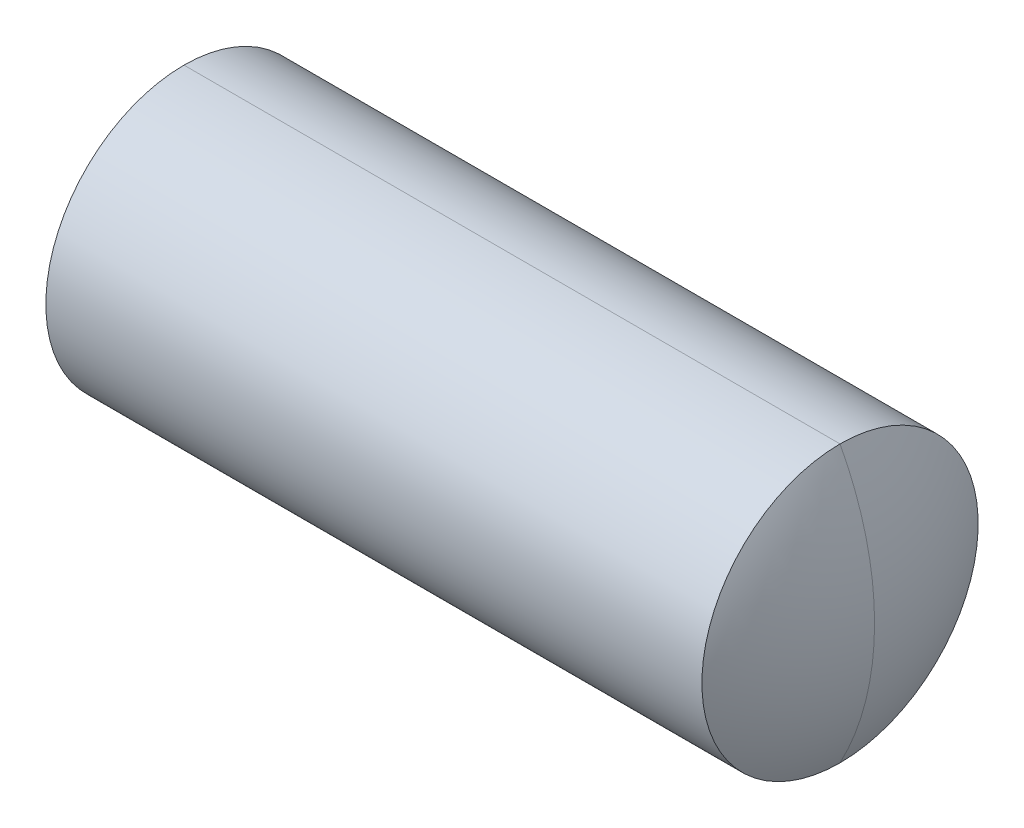
ISO-10303-21;
HEADER;
FILE_DESCRIPTION(('STEP AP214'),'2;1');
FILE_NAME('part.step','',(''),(''),'','','');
FILE_SCHEMA(('AUTOMOTIVE_DESIGN { 1 0 10303 214 1 1 1 1 }'));
ENDSEC;
DATA;
#1=APPLICATION_CONTEXT('core data for automotive mechanical design processes');
#2=APPLICATION_PROTOCOL_DEFINITION('international standard','automotive_design',2000,#1);
#3=PRODUCT_CONTEXT('',#1,'mechanical');
#4=PRODUCT('Part','Part','',(#3));
#5=PRODUCT_RELATED_PRODUCT_CATEGORY('part','',(#4));
#6=PRODUCT_DEFINITION_FORMATION('','',#4);
#7=PRODUCT_DEFINITION_CONTEXT('part definition',#1,'design');
#8=PRODUCT_DEFINITION('design','',#6,#7);
#9=PRODUCT_DEFINITION_SHAPE('','',#8);
#10=(LENGTH_UNIT() NAMED_UNIT(*) SI_UNIT(.MILLI.,.METRE.));
#11=(NAMED_UNIT(*) PLANE_ANGLE_UNIT() SI_UNIT($,.RADIAN.));
#12=(NAMED_UNIT(*) SI_UNIT($,.STERADIAN.) SOLID_ANGLE_UNIT());
#13=UNCERTAINTY_MEASURE_WITH_UNIT(LENGTH_MEASURE(1.E-05),#10,'distance_accuracy_value','');
#14=(GEOMETRIC_REPRESENTATION_CONTEXT(3) GLOBAL_UNCERTAINTY_ASSIGNED_CONTEXT((#13)) GLOBAL_UNIT_ASSIGNED_CONTEXT((#10,
#11,#12)) REPRESENTATION_CONTEXT('',''));
#15=CARTESIAN_POINT('',(0.,0.,0.));
#16=DIRECTION('',(0.,0.,1.));
#17=DIRECTION('',(1.,0.,0.));
#18=AXIS2_PLACEMENT_3D('',#15,#16,#17);
#19=CARTESIAN_POINT('',(3.,-0.5773502691896,-1.));
#20=DIRECTION('',(0.,-0.866025403784429,-0.500000000000017));
#21=DIRECTION('',(0.,0.500000000000017,-0.866025403784429));
#22=AXIS2_PLACEMENT_3D('',#19,#20,#21);
#23=PLANE('',#22);
#24=DIRECTION('',(0.,0.500000000000017,-0.866025403784429));
#25=VECTOR('',#24,1.);
#26=CARTESIAN_POINT('',(3.,-0.5773502691896,-1.));
#27=LINE('',#26,#25);
#28=CARTESIAN_POINT('',(3.,-0.5773502691896,-1.));
#29=VERTEX_POINT('',#28);
#30=CARTESIAN_POINT('',(3.,-1.15470053837909,0.));
#31=VERTEX_POINT('',#30);
#32=EDGE_CURVE('E163',#29,#31,#27,.F.);
#33=ORIENTED_EDGE('',*,*,#32,.F.);
#34=DIRECTION('',(-1.,0.,0.));
#35=VECTOR('',#34,1.);
#36=CARTESIAN_POINT('',(3.,-0.5773502691896,-1.));
#37=LINE('',#36,#35);
#38=CARTESIAN_POINT('',(0.,-0.5773502691896,-1.));
#39=VERTEX_POINT('',#38);
#40=EDGE_CURVE('E92',#29,#39,#37,.T.);
#41=ORIENTED_EDGE('',*,*,#40,.T.);
#42=DIRECTION('',(0.,0.500000000000017,-0.866025403784429));
#43=VECTOR('',#42,1.);
#44=CARTESIAN_POINT('',(0.,-0.5773502691896,-1.));
#45=LINE('',#44,#43);
#46=CARTESIAN_POINT('',(0.,-1.15470053837905,0.));
#47=VERTEX_POINT('',#46);
#48=EDGE_CURVE('E165',#47,#39,#45,.T.);
#49=ORIENTED_EDGE('',*,*,#48,.F.);
#50=DIRECTION('',(1.,0.,0.));
#51=VECTOR('',#50,1.);
#52=CARTESIAN_POINT('',(3.,-1.154700538379,0.));
#53=LINE('',#52,#51);
#54=EDGE_CURVE('E158',#47,#31,#53,.T.);
#55=ORIENTED_EDGE('',*,*,#54,.T.);
#56=EDGE_LOOP('',(#33,#41,#49,#55));
#57=FACE_BOUND('',#56,.T.);
#58=ADVANCED_FACE('F17',(#57),#23,.F.);
#59=CARTESIAN_POINT('',(3.,-1.154700538379,0.));
#60=DIRECTION('',(0.,-0.866025403784429,0.500000000000017));
#61=DIRECTION('',(0.,-0.500000000000017,-0.866025403784429));
#62=AXIS2_PLACEMENT_3D('',#59,#60,#61);
#63=PLANE('',#62);
#64=DIRECTION('',(0.,-0.500000000000017,-0.866025403784429));
#65=VECTOR('',#64,1.);
#66=CARTESIAN_POINT('',(3.,-1.154700538379,0.));
#67=LINE('',#66,#65);
#68=CARTESIAN_POINT('',(3.,-0.577350269189506,0.999999999999946));
#69=VERTEX_POINT('',#68);
#70=EDGE_CURVE('E156',#31,#69,#67,.F.);
#71=ORIENTED_EDGE('',*,*,#70,.F.);
#72=ORIENTED_EDGE('',*,*,#54,.F.);
#73=DIRECTION('',(0.,-0.500000000000017,-0.866025403784429));
#74=VECTOR('',#73,1.);
#75=CARTESIAN_POINT('',(0.,-1.154700538379,0.));
#76=LINE('',#75,#74);
#77=CARTESIAN_POINT('',(0.,-0.577350269189553,0.999999999999973));
#78=VERTEX_POINT('',#77);
#79=EDGE_CURVE('E161',#78,#47,#76,.T.);
#80=ORIENTED_EDGE('',*,*,#79,.F.);
#81=DIRECTION('',(1.,0.,0.));
#82=VECTOR('',#81,1.);
#83=CARTESIAN_POINT('',(3.,-0.5773502691896,1.));
#84=LINE('',#83,#82);
#85=EDGE_CURVE('E88',#78,#69,#84,.T.);
#86=ORIENTED_EDGE('',*,*,#85,.T.);
#87=EDGE_LOOP('',(#71,#72,#80,#86));
#88=FACE_BOUND('',#87,.T.);
#89=ADVANCED_FACE('F234',(#88),#63,.F.);
#90=CARTESIAN_POINT('',(3.,0.5773502691896,-1.));
#91=DIRECTION('',(0.,0.,-1.));
#92=DIRECTION('',(-1.,0.,0.));
#93=AXIS2_PLACEMENT_3D('',#90,#91,#92);
#94=PLANE('',#93);
#95=DIRECTION('',(0.,1.,0.));
#96=VECTOR('',#95,1.);
#97=CARTESIAN_POINT('',(3.,1.154700538379,-1.));
#98=LINE('',#97,#96);
#99=CARTESIAN_POINT('',(3.,0.577350269189553,-0.999999999999973));
#100=VERTEX_POINT('',#99);
#101=EDGE_CURVE('E148',#100,#29,#98,.F.);
#102=ORIENTED_EDGE('',*,*,#101,.F.);
#103=DIRECTION('',(1.,0.,0.));
#104=VECTOR('',#103,1.);
#105=CARTESIAN_POINT('',(3.,0.577350269189411,-0.999999999999891));
#106=LINE('',#105,#104);
#107=CARTESIAN_POINT('',(0.,0.577350269189553,-0.999999999999973));
#108=VERTEX_POINT('',#107);
#109=EDGE_CURVE('E101',#100,#108,#106,.F.);
#110=ORIENTED_EDGE('',*,*,#109,.T.);
#111=DIRECTION('',(0.,1.,0.));
#112=VECTOR('',#111,1.);
#113=CARTESIAN_POINT('',(0.,0.5773502691896,-1.));
#114=LINE('',#113,#112);
#115=EDGE_CURVE('E154',#39,#108,#114,.T.);
#116=ORIENTED_EDGE('',*,*,#115,.F.);
#117=ORIENTED_EDGE('',*,*,#40,.F.);
#118=EDGE_LOOP('',(#102,#110,#116,#117));
#119=FACE_BOUND('',#118,.T.);
#120=ADVANCED_FACE('F226',(#119),#94,.F.);
#121=CARTESIAN_POINT('',(3.,-0.5773502691896,1.));
#122=DIRECTION('',(0.,0.,1.));
#123=DIRECTION('',(1.,0.,0.));
#124=AXIS2_PLACEMENT_3D('',#121,#122,#123);
#125=PLANE('',#124);
#126=DIRECTION('',(0.,1.,0.));
#127=VECTOR('',#126,1.);
#128=CARTESIAN_POINT('',(3.,1.154700538379,1.));
#129=LINE('',#128,#127);
#130=CARTESIAN_POINT('',(3.,0.5773502691896,1.));
#131=VERTEX_POINT('',#130);
#132=EDGE_CURVE('E146',#69,#131,#129,.T.);
#133=ORIENTED_EDGE('',*,*,#132,.F.);
#134=ORIENTED_EDGE('',*,*,#85,.F.);
#135=DIRECTION('',(0.,1.,0.));
#136=VECTOR('',#135,1.);
#137=CARTESIAN_POINT('',(0.,-0.5773502691896,1.));
#138=LINE('',#137,#136);
#139=CARTESIAN_POINT('',(0.,0.5773502691896,1.));
#140=VERTEX_POINT('',#139);
#141=EDGE_CURVE('E81',#140,#78,#138,.F.);
#142=ORIENTED_EDGE('',*,*,#141,.F.);
#143=DIRECTION('',(1.,0.,0.));
#144=VECTOR('',#143,1.);
#145=CARTESIAN_POINT('',(3.,0.5773502691896,1.));
#146=LINE('',#145,#144);
#147=EDGE_CURVE('E85',#140,#131,#146,.T.);
#148=ORIENTED_EDGE('',*,*,#147,.T.);
#149=EDGE_LOOP('',(#133,#134,#142,#148));
#150=FACE_BOUND('',#149,.T.);
#151=ADVANCED_FACE('F84',(#150),#125,.F.);
#152=CARTESIAN_POINT('',(3.,1.154700538379,0.));
#153=DIRECTION('',(-1.,0.,0.));
#154=DIRECTION('',(0.,0.,1.));
#155=AXIS2_PLACEMENT_3D('',#152,#153,#154);
#156=PLANE('',#155);
#157=ORIENTED_EDGE('',*,*,#132,.T.);
#158=DIRECTION('',(0.,-0.500000000000017,0.866025403784429));
#159=VECTOR('',#158,1.);
#160=CARTESIAN_POINT('',(3.,0.5773502691896,1.));
#161=LINE('',#160,#159);
#162=CARTESIAN_POINT('',(3.,1.15470053837905,0.));
#163=VERTEX_POINT('',#162);
#164=EDGE_CURVE('E100',#131,#163,#161,.F.);
#165=ORIENTED_EDGE('',*,*,#164,.T.);
#166=DIRECTION('',(0.,0.500000000000017,0.866025403784429));
#167=VECTOR('',#166,1.);
#168=CARTESIAN_POINT('',(3.,1.154700538379,0.));
#169=LINE('',#168,#167);
#170=EDGE_CURVE('E142',#163,#100,#169,.F.);
#171=ORIENTED_EDGE('',*,*,#170,.T.);
#172=ORIENTED_EDGE('',*,*,#101,.T.);
#173=ORIENTED_EDGE('',*,*,#32,.T.);
#174=ORIENTED_EDGE('',*,*,#70,.T.);
#175=EDGE_LOOP('',(#157,#165,#171,#172,#173,#174));
#176=FACE_BOUND('',#175,.T.);
#177=ADVANCED_FACE('F211',(#176),#156,.T.);
#178=CARTESIAN_POINT('',(3.,1.154700538379,0.));
#179=DIRECTION('',(0.,0.866025403784429,-0.500000000000017));
#180=DIRECTION('',(0.,0.500000000000017,0.866025403784429));
#181=AXIS2_PLACEMENT_3D('',#178,#179,#180);
#182=PLANE('',#181);
#183=ORIENTED_EDGE('',*,*,#170,.F.);
#184=DIRECTION('',(1.,0.,0.));
#185=VECTOR('',#184,1.);
#186=CARTESIAN_POINT('',(3.,1.15470053837919,1.08637057683047E-13));
#187=LINE('',#186,#185);
#188=CARTESIAN_POINT('',(0.,1.15470053837905,0.));
#189=VERTEX_POINT('',#188);
#190=EDGE_CURVE('E176',#163,#189,#187,.F.);
#191=ORIENTED_EDGE('',*,*,#190,.T.);
#192=DIRECTION('',(0.,0.500000000000017,0.866025403784429));
#193=VECTOR('',#192,1.);
#194=CARTESIAN_POINT('',(0.,1.154700538379,0.));
#195=LINE('',#194,#193);
#196=EDGE_CURVE('E106',#108,#189,#195,.T.);
#197=ORIENTED_EDGE('',*,*,#196,.F.);
#198=ORIENTED_EDGE('',*,*,#109,.F.);
#199=EDGE_LOOP('',(#183,#191,#197,#198));
#200=FACE_BOUND('',#199,.T.);
#201=ADVANCED_FACE('F134',(#200),#182,.F.);
#202=CARTESIAN_POINT('',(5.75,0.,0.));
#203=DIRECTION('',(0.,-1.,0.));
#204=DIRECTION('',(0.,0.,1.));
#205=AXIS2_PLACEMENT_3D('',#202,#203,#204);
#206=SPHERICAL_SURFACE('',#205,4.25);
#207=CARTESIAN_POINT('',(5.75,0.,0.));
#208=DIRECTION('',(0.,0.,1.));
#209=DIRECTION('',(0.,-1.,0.));
#210=AXIS2_PLACEMENT_3D('',#207,#208,#209);
#211=CIRCLE('',#210,4.25);
#212=CARTESIAN_POINT('',(9.5,-2.,0.));
#213=VERTEX_POINT('',#212);
#214=CARTESIAN_POINT('',(10.,0.,0.));
#215=VERTEX_POINT('',#214);
#216=EDGE_CURVE('E174',#213,#215,#211,.T.);
#217=ORIENTED_EDGE('',*,*,#216,.F.);
#218=CARTESIAN_POINT('',(9.5,0.,0.));
#219=DIRECTION('',(-1.,0.,0.));
#220=DIRECTION('',(0.,0.,1.));
#221=AXIS2_PLACEMENT_3D('',#218,#219,#220);
#222=CIRCLE('',#221,2.);
#223=CARTESIAN_POINT('',(9.5,2.,0.));
#224=VERTEX_POINT('',#223);
#225=EDGE_CURVE('E20',#224,#213,#222,.T.);
#226=ORIENTED_EDGE('',*,*,#225,.F.);
#227=CARTESIAN_POINT('',(5.75,0.,0.));
#228=DIRECTION('',(0.,0.,1.));
#229=DIRECTION('',(0.,-1.,0.));
#230=AXIS2_PLACEMENT_3D('',#227,#228,#229);
#231=CIRCLE('',#230,4.25);
#232=EDGE_CURVE('E118',#215,#224,#231,.T.);
#233=ORIENTED_EDGE('',*,*,#232,.F.);
#234=EDGE_LOOP('',(#217,#226,#233));
#235=FACE_BOUND('',#234,.T.);
#236=ADVANCED_FACE('F130',(#235),#206,.T.);
#237=CARTESIAN_POINT('',(3.,0.5773502691896,1.));
#238=DIRECTION('',(0.,0.866025403784429,0.500000000000017));
#239=DIRECTION('',(0.,-0.500000000000017,0.866025403784429));
#240=AXIS2_PLACEMENT_3D('',#237,#238,#239);
#241=PLANE('',#240);
#242=ORIENTED_EDGE('',*,*,#164,.F.);
#243=ORIENTED_EDGE('',*,*,#147,.F.);
#244=DIRECTION('',(0.,0.499999999999853,-0.866025403784523));
#245=VECTOR('',#244,1.);
#246=CARTESIAN_POINT('',(0.,0.5773502691896,1.));
#247=LINE('',#246,#245);
#248=EDGE_CURVE('E99',#140,#189,#247,.T.);
#249=ORIENTED_EDGE('',*,*,#248,.T.);
#250=ORIENTED_EDGE('',*,*,#190,.F.);
#251=EDGE_LOOP('',(#242,#243,#249,#250));
#252=FACE_BOUND('',#251,.T.);
#253=ADVANCED_FACE('F97',(#252),#241,.F.);
#254=CARTESIAN_POINT('',(5.75,0.,0.));
#255=DIRECTION('',(0.,-1.,0.));
#256=DIRECTION('',(0.,0.,1.));
#257=AXIS2_PLACEMENT_3D('',#254,#255,#256);
#258=SPHERICAL_SURFACE('',#257,4.25);
#259=ORIENTED_EDGE('',*,*,#232,.T.);
#260=CARTESIAN_POINT('',(9.5,0.,0.));
#261=DIRECTION('',(-1.,0.,0.));
#262=DIRECTION('',(0.,0.,1.));
#263=AXIS2_PLACEMENT_3D('',#260,#261,#262);
#264=CIRCLE('',#263,2.);
#265=EDGE_CURVE('E111',#213,#224,#264,.T.);
#266=ORIENTED_EDGE('',*,*,#265,.F.);
#267=ORIENTED_EDGE('',*,*,#216,.T.);
#268=EDGE_LOOP('',(#259,#266,#267));
#269=FACE_BOUND('',#268,.T.);
#270=ADVANCED_FACE('F121',(#269),#258,.T.);
#271=CARTESIAN_POINT('',(0.,0.,0.));
#272=DIRECTION('',(-1.,0.,0.));
#273=DIRECTION('',(0.,0.,1.));
#274=AXIS2_PLACEMENT_3D('',#271,#272,#273);
#275=CYLINDRICAL_SURFACE('',#274,2.);
#276=DIRECTION('',(-1.,0.,0.));
#277=VECTOR('',#276,1.);
#278=CARTESIAN_POINT('',(0.,-2.,0.));
#279=LINE('',#278,#277);
#280=CARTESIAN_POINT('',(0.,-2.,0.));
#281=VERTEX_POINT('',#280);
#282=EDGE_CURVE('E108',#281,#213,#279,.F.);
#283=ORIENTED_EDGE('',*,*,#282,.F.);
#284=CARTESIAN_POINT('',(0.,0.,0.));
#285=DIRECTION('',(-1.,0.,0.));
#286=DIRECTION('',(0.,0.,1.));
#287=AXIS2_PLACEMENT_3D('',#284,#285,#286);
#288=CIRCLE('',#287,2.);
#289=CARTESIAN_POINT('',(0.,2.,0.));
#290=VERTEX_POINT('',#289);
#291=EDGE_CURVE('E35',#281,#290,#288,.F.);
#292=ORIENTED_EDGE('',*,*,#291,.T.);
#293=DIRECTION('',(-1.,0.,0.));
#294=VECTOR('',#293,1.);
#295=CARTESIAN_POINT('',(0.,2.,0.));
#296=LINE('',#295,#294);
#297=EDGE_CURVE('E26',#224,#290,#296,.T.);
#298=ORIENTED_EDGE('',*,*,#297,.F.);
#299=ORIENTED_EDGE('',*,*,#225,.T.);
#300=EDGE_LOOP('',(#283,#292,#298,#299));
#301=FACE_BOUND('',#300,.T.);
#302=ADVANCED_FACE('F125',(#301),#275,.T.);
#303=CARTESIAN_POINT('',(0.,0.,0.));
#304=DIRECTION('',(1.,0.,0.));
#305=DIRECTION('',(0.,0.,-1.));
#306=AXIS2_PLACEMENT_3D('',#303,#304,#305);
#307=PLANE('',#306);
#308=ORIENTED_EDGE('',*,*,#141,.T.);
#309=ORIENTED_EDGE('',*,*,#79,.T.);
#310=ORIENTED_EDGE('',*,*,#48,.T.);
#311=ORIENTED_EDGE('',*,*,#115,.T.);
#312=ORIENTED_EDGE('',*,*,#196,.T.);
#313=ORIENTED_EDGE('',*,*,#248,.F.);
#314=EDGE_LOOP('',(#308,#309,#310,#311,#312,#313));
#315=FACE_BOUND('',#314,.T.);
#316=CARTESIAN_POINT('',(0.,0.,0.));
#317=DIRECTION('',(-1.,0.,0.));
#318=DIRECTION('',(0.,0.,1.));
#319=AXIS2_PLACEMENT_3D('',#316,#317,#318);
#320=CIRCLE('',#319,2.);
#321=EDGE_CURVE('E11',#290,#281,#320,.F.);
#322=ORIENTED_EDGE('',*,*,#321,.F.);
#323=ORIENTED_EDGE('',*,*,#291,.F.);
#324=EDGE_LOOP('',(#322,#323));
#325=FACE_BOUND('',#324,.T.);
#326=ADVANCED_FACE('F103',(#315,#325),#307,.F.);
#327=CARTESIAN_POINT('',(0.,0.,0.));
#328=DIRECTION('',(-1.,0.,0.));
#329=DIRECTION('',(0.,0.,1.));
#330=AXIS2_PLACEMENT_3D('',#327,#328,#329);
#331=CYLINDRICAL_SURFACE('',#330,2.);
#332=ORIENTED_EDGE('',*,*,#297,.T.);
#333=ORIENTED_EDGE('',*,*,#321,.T.);
#334=ORIENTED_EDGE('',*,*,#282,.T.);
#335=ORIENTED_EDGE('',*,*,#265,.T.);
#336=EDGE_LOOP('',(#332,#333,#334,#335));
#337=FACE_BOUND('',#336,.T.);
#338=ADVANCED_FACE('F170',(#337),#331,.T.);
#339=CLOSED_SHELL('',(#58,#89,#120,#151,#177,#201,#236,#253,#270,#302,#326,#338));
#340=MANIFOLD_SOLID_BREP('B1',#339);
#341=ADVANCED_BREP_SHAPE_REPRESENTATION('',(#18,#340),#14);
#342=SHAPE_DEFINITION_REPRESENTATION(#9,#341);
ENDSEC;
END-ISO-10303-21;
